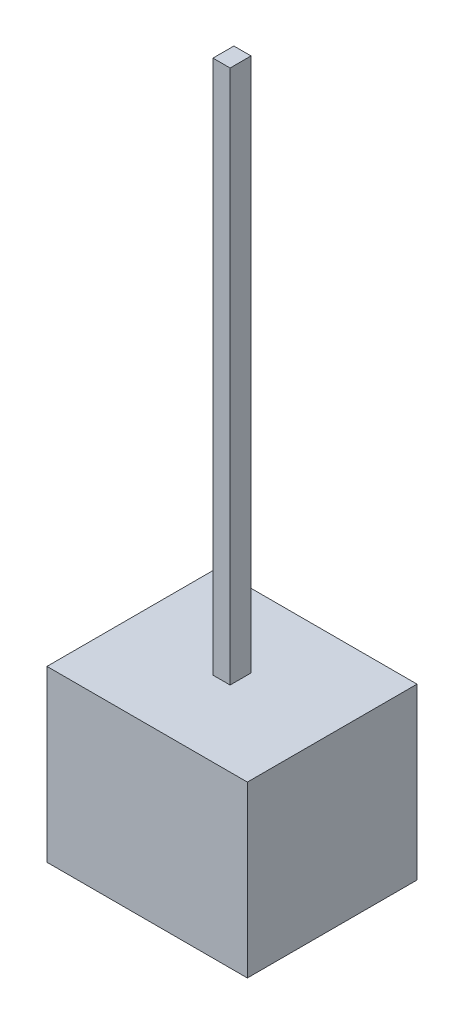
ISO-10303-21;
HEADER;
FILE_DESCRIPTION(('STEP AP214'),'2;1');
FILE_NAME('part.step','',(''),(''),'','','');
FILE_SCHEMA(('AUTOMOTIVE_DESIGN { 1 0 10303 214 1 1 1 1 }'));
ENDSEC;
DATA;
#1=APPLICATION_CONTEXT('core data for automotive mechanical design processes');
#2=APPLICATION_PROTOCOL_DEFINITION('international standard','automotive_design',2000,#1);
#3=PRODUCT_CONTEXT('',#1,'mechanical');
#4=PRODUCT('Part','Part','',(#3));
#5=PRODUCT_RELATED_PRODUCT_CATEGORY('part','',(#4));
#6=PRODUCT_DEFINITION_FORMATION('','',#4);
#7=PRODUCT_DEFINITION_CONTEXT('part definition',#1,'design');
#8=PRODUCT_DEFINITION('design','',#6,#7);
#9=PRODUCT_DEFINITION_SHAPE('','',#8);
#10=(LENGTH_UNIT() NAMED_UNIT(*) SI_UNIT(.MILLI.,.METRE.));
#11=(NAMED_UNIT(*) PLANE_ANGLE_UNIT() SI_UNIT($,.RADIAN.));
#12=(NAMED_UNIT(*) SI_UNIT($,.STERADIAN.) SOLID_ANGLE_UNIT());
#13=UNCERTAINTY_MEASURE_WITH_UNIT(LENGTH_MEASURE(1.E-05),#10,'distance_accuracy_value','');
#14=(GEOMETRIC_REPRESENTATION_CONTEXT(3) GLOBAL_UNCERTAINTY_ASSIGNED_CONTEXT((#13)) GLOBAL_UNIT_ASSIGNED_CONTEXT((#10,
#11,#12)) REPRESENTATION_CONTEXT('',''));
#15=CARTESIAN_POINT('',(0.,0.,0.));
#16=DIRECTION('',(0.,0.,1.));
#17=DIRECTION('',(1.,0.,0.));
#18=AXIS2_PLACEMENT_3D('',#15,#16,#17);
#19=CARTESIAN_POINT('',(3.,0.,0.));
#20=DIRECTION('',(0.,-1.,0.));
#21=DIRECTION('',(0.,0.,-1.));
#22=AXIS2_PLACEMENT_3D('',#19,#20,#21);
#23=PLANE('',#22);
#24=DIRECTION('',(0.,0.,1.));
#25=VECTOR('',#24,1.);
#26=CARTESIAN_POINT('',(0.,0.,0.));
#27=LINE('',#26,#25);
#28=CARTESIAN_POINT('',(0.,0.,-2.54));
#29=VERTEX_POINT('',#28);
#30=CARTESIAN_POINT('',(0.,0.,0.));
#31=VERTEX_POINT('',#30);
#32=EDGE_CURVE('E134',#29,#31,#27,.T.);
#33=ORIENTED_EDGE('',*,*,#32,.T.);
#34=DIRECTION('',(-1.,0.,0.));
#35=VECTOR('',#34,1.);
#36=CARTESIAN_POINT('',(3.,0.,0.));
#37=LINE('',#36,#35);
#38=CARTESIAN_POINT('',(3.,0.,0.));
#39=VERTEX_POINT('',#38);
#40=EDGE_CURVE('E139',#39,#31,#37,.T.);
#41=ORIENTED_EDGE('',*,*,#40,.F.);
#42=DIRECTION('',(0.,0.,1.));
#43=VECTOR('',#42,1.);
#44=CARTESIAN_POINT('',(3.,0.,0.));
#45=LINE('',#44,#43);
#46=CARTESIAN_POINT('',(3.,0.,-2.54));
#47=VERTEX_POINT('',#46);
#48=EDGE_CURVE('E138',#47,#39,#45,.T.);
#49=ORIENTED_EDGE('',*,*,#48,.F.);
#50=DIRECTION('',(-1.,0.,0.));
#51=VECTOR('',#50,1.);
#52=CARTESIAN_POINT('',(3.,0.,-2.54));
#53=LINE('',#52,#51);
#54=EDGE_CURVE('E147',#47,#29,#53,.T.);
#55=ORIENTED_EDGE('',*,*,#54,.T.);
#56=EDGE_LOOP('',(#33,#41,#49,#55));
#57=FACE_BOUND('',#56,.T.);
#58=DIRECTION('',(0.,0.,1.));
#59=VECTOR('',#58,1.);
#60=CARTESIAN_POINT('',(1.35618349313781,0.,-1.44206617785299));
#61=LINE('',#60,#59);
#62=CARTESIAN_POINT('',(1.35618349313781,0.,-1.44206617785299));
#63=VERTEX_POINT('',#62);
#64=CARTESIAN_POINT('',(1.35618349313781,0.,-1.12875164504607));
#65=VERTEX_POINT('',#64);
#66=EDGE_CURVE('E120',#63,#65,#61,.T.);
#67=ORIENTED_EDGE('',*,*,#66,.F.);
#68=DIRECTION('',(-1.,0.,0.));
#69=VECTOR('',#68,1.);
#70=CARTESIAN_POINT('',(1.35618349313781,0.,-1.44206617785299));
#71=LINE('',#70,#69);
#72=CARTESIAN_POINT('',(1.61299868396315,0.,-1.44206617785299));
#73=VERTEX_POINT('',#72);
#74=EDGE_CURVE('E117',#73,#63,#71,.T.);
#75=ORIENTED_EDGE('',*,*,#74,.F.);
#76=DIRECTION('',(0.,0.,-1.));
#77=VECTOR('',#76,1.);
#78=CARTESIAN_POINT('',(1.61299868396315,0.,-1.44206617785299));
#79=LINE('',#78,#77);
#80=CARTESIAN_POINT('',(1.61299868396315,0.,-1.12875164504607));
#81=VERTEX_POINT('',#80);
#82=EDGE_CURVE('E55',#81,#73,#79,.T.);
#83=ORIENTED_EDGE('',*,*,#82,.F.);
#84=DIRECTION('',(1.,0.,0.));
#85=VECTOR('',#84,1.);
#86=CARTESIAN_POINT('',(1.35618349313781,0.,-1.12875164504607));
#87=LINE('',#86,#85);
#88=EDGE_CURVE('E50',#65,#81,#87,.T.);
#89=ORIENTED_EDGE('',*,*,#88,.F.);
#90=EDGE_LOOP('',(#67,#75,#83,#89));
#91=FACE_BOUND('',#90,.T.);
#92=ADVANCED_FACE('F35',(#57,#91),#23,.F.);
#93=CARTESIAN_POINT('',(3.,0.,0.));
#94=DIRECTION('',(0.,0.,-1.));
#95=DIRECTION('',(0.,1.,0.));
#96=AXIS2_PLACEMENT_3D('',#93,#94,#95);
#97=PLANE('',#96);
#98=DIRECTION('',(0.,-1.,0.));
#99=VECTOR('',#98,1.);
#100=CARTESIAN_POINT('',(0.,0.,0.));
#101=LINE('',#100,#99);
#102=CARTESIAN_POINT('',(0.,-2.54,0.));
#103=VERTEX_POINT('',#102);
#104=EDGE_CURVE('E121',#31,#103,#101,.T.);
#105=ORIENTED_EDGE('',*,*,#104,.T.);
#106=DIRECTION('',(-1.,0.,0.));
#107=VECTOR('',#106,1.);
#108=CARTESIAN_POINT('',(3.,-2.54,0.));
#109=LINE('',#108,#107);
#110=CARTESIAN_POINT('',(3.,-2.54,0.));
#111=VERTEX_POINT('',#110);
#112=EDGE_CURVE('E11',#111,#103,#109,.T.);
#113=ORIENTED_EDGE('',*,*,#112,.F.);
#114=DIRECTION('',(0.,-1.,0.));
#115=VECTOR('',#114,1.);
#116=CARTESIAN_POINT('',(3.,0.,0.));
#117=LINE('',#116,#115);
#118=EDGE_CURVE('E130',#39,#111,#117,.T.);
#119=ORIENTED_EDGE('',*,*,#118,.F.);
#120=ORIENTED_EDGE('',*,*,#40,.T.);
#121=EDGE_LOOP('',(#105,#113,#119,#120));
#122=FACE_BOUND('',#121,.T.);
#123=ADVANCED_FACE('F37',(#122),#97,.F.);
#124=CARTESIAN_POINT('',(3.,-2.54,0.));
#125=DIRECTION('',(0.,1.,0.));
#126=DIRECTION('',(0.,0.,1.));
#127=AXIS2_PLACEMENT_3D('',#124,#125,#126);
#128=PLANE('',#127);
#129=DIRECTION('',(0.,0.,-1.));
#130=VECTOR('',#129,1.);
#131=CARTESIAN_POINT('',(0.,-2.54,0.));
#132=LINE('',#131,#130);
#133=CARTESIAN_POINT('',(0.,-2.54,-2.54));
#134=VERTEX_POINT('',#133);
#135=EDGE_CURVE('E124',#103,#134,#132,.T.);
#136=ORIENTED_EDGE('',*,*,#135,.T.);
#137=DIRECTION('',(-1.,0.,0.));
#138=VECTOR('',#137,1.);
#139=CARTESIAN_POINT('',(3.,-2.54,-2.54));
#140=LINE('',#139,#138);
#141=CARTESIAN_POINT('',(3.,-2.54,-2.54));
#142=VERTEX_POINT('',#141);
#143=EDGE_CURVE('E43',#142,#134,#140,.T.);
#144=ORIENTED_EDGE('',*,*,#143,.F.);
#145=DIRECTION('',(0.,0.,-1.));
#146=VECTOR('',#145,1.);
#147=CARTESIAN_POINT('',(3.,-2.54,0.));
#148=LINE('',#147,#146);
#149=EDGE_CURVE('E133',#111,#142,#148,.T.);
#150=ORIENTED_EDGE('',*,*,#149,.F.);
#151=ORIENTED_EDGE('',*,*,#112,.T.);
#152=EDGE_LOOP('',(#136,#144,#150,#151));
#153=FACE_BOUND('',#152,.T.);
#154=ADVANCED_FACE('F169',(#153),#128,.F.);
#155=CARTESIAN_POINT('',(3.,0.,-2.54));
#156=DIRECTION('',(0.,0.,1.));
#157=DIRECTION('',(1.,0.,0.));
#158=AXIS2_PLACEMENT_3D('',#155,#156,#157);
#159=PLANE('',#158);
#160=DIRECTION('',(0.,1.,0.));
#161=VECTOR('',#160,1.);
#162=CARTESIAN_POINT('',(0.,0.,-2.54));
#163=LINE('',#162,#161);
#164=EDGE_CURVE('E142',#134,#29,#163,.T.);
#165=ORIENTED_EDGE('',*,*,#164,.T.);
#166=ORIENTED_EDGE('',*,*,#54,.F.);
#167=DIRECTION('',(0.,1.,0.));
#168=VECTOR('',#167,1.);
#169=CARTESIAN_POINT('',(3.,0.,-2.54));
#170=LINE('',#169,#168);
#171=EDGE_CURVE('E136',#142,#47,#170,.T.);
#172=ORIENTED_EDGE('',*,*,#171,.F.);
#173=ORIENTED_EDGE('',*,*,#143,.T.);
#174=EDGE_LOOP('',(#165,#166,#172,#173));
#175=FACE_BOUND('',#174,.T.);
#176=ADVANCED_FACE('F154',(#175),#159,.F.);
#177=CARTESIAN_POINT('',(3.,0.,0.));
#178=DIRECTION('',(1.,0.,0.));
#179=DIRECTION('',(0.,0.,-1.));
#180=AXIS2_PLACEMENT_3D('',#177,#178,#179);
#181=PLANE('',#180);
#182=ORIENTED_EDGE('',*,*,#118,.T.);
#183=ORIENTED_EDGE('',*,*,#149,.T.);
#184=ORIENTED_EDGE('',*,*,#171,.T.);
#185=ORIENTED_EDGE('',*,*,#48,.T.);
#186=EDGE_LOOP('',(#182,#183,#184,#185));
#187=FACE_BOUND('',#186,.T.);
#188=ADVANCED_FACE('F168',(#187),#181,.T.);
#189=CARTESIAN_POINT('',(0.,0.,0.));
#190=DIRECTION('',(1.,0.,0.));
#191=DIRECTION('',(0.,0.,-1.));
#192=AXIS2_PLACEMENT_3D('',#189,#190,#191);
#193=PLANE('',#192);
#194=ORIENTED_EDGE('',*,*,#104,.F.);
#195=ORIENTED_EDGE('',*,*,#32,.F.);
#196=ORIENTED_EDGE('',*,*,#164,.F.);
#197=ORIENTED_EDGE('',*,*,#135,.F.);
#198=EDGE_LOOP('',(#194,#195,#196,#197));
#199=FACE_BOUND('',#198,.T.);
#200=ADVANCED_FACE('F160',(#199),#193,.F.);
#201=CARTESIAN_POINT('',(1.35618349313781,8.,-1.44206617785299));
#202=DIRECTION('',(1.,0.,0.));
#203=DIRECTION('',(0.,0.,-1.));
#204=AXIS2_PLACEMENT_3D('',#201,#202,#203);
#205=PLANE('',#204);
#206=ORIENTED_EDGE('',*,*,#66,.T.);
#207=DIRECTION('',(0.,-1.,0.));
#208=VECTOR('',#207,1.);
#209=CARTESIAN_POINT('',(1.35618349313781,8.,-1.12875164504607));
#210=LINE('',#209,#208);
#211=CARTESIAN_POINT('',(1.35618349313781,8.,-1.12875164504607));
#212=VERTEX_POINT('',#211);
#213=EDGE_CURVE('E101',#212,#65,#210,.T.);
#214=ORIENTED_EDGE('',*,*,#213,.F.);
#215=DIRECTION('',(0.,0.,1.));
#216=VECTOR('',#215,1.);
#217=CARTESIAN_POINT('',(1.35618349313781,8.,-1.44206617785299));
#218=LINE('',#217,#216);
#219=CARTESIAN_POINT('',(1.35618349313781,8.,-1.44206617785299));
#220=VERTEX_POINT('',#219);
#221=EDGE_CURVE('E108',#220,#212,#218,.T.);
#222=ORIENTED_EDGE('',*,*,#221,.F.);
#223=DIRECTION('',(0.,-1.,0.));
#224=VECTOR('',#223,1.);
#225=CARTESIAN_POINT('',(1.35618349313781,8.,-1.44206617785299));
#226=LINE('',#225,#224);
#227=EDGE_CURVE('E262',#220,#63,#226,.T.);
#228=ORIENTED_EDGE('',*,*,#227,.T.);
#229=EDGE_LOOP('',(#206,#214,#222,#228));
#230=FACE_BOUND('',#229,.T.);
#231=ADVANCED_FACE('F119',(#230),#205,.F.);
#232=CARTESIAN_POINT('',(1.35618349313781,8.,-1.12875164504607));
#233=DIRECTION('',(0.,0.,-1.));
#234=DIRECTION('',(-1.,0.,0.));
#235=AXIS2_PLACEMENT_3D('',#232,#233,#234);
#236=PLANE('',#235);
#237=ORIENTED_EDGE('',*,*,#88,.T.);
#238=DIRECTION('',(0.,-1.,0.));
#239=VECTOR('',#238,1.);
#240=CARTESIAN_POINT('',(1.61299868396315,8.,-1.12875164504607));
#241=LINE('',#240,#239);
#242=CARTESIAN_POINT('',(1.61299868396315,8.,-1.12875164504607));
#243=VERTEX_POINT('',#242);
#244=EDGE_CURVE('E104',#243,#81,#241,.T.);
#245=ORIENTED_EDGE('',*,*,#244,.F.);
#246=DIRECTION('',(1.,0.,0.));
#247=VECTOR('',#246,1.);
#248=CARTESIAN_POINT('',(1.35618349313781,8.,-1.12875164504607));
#249=LINE('',#248,#247);
#250=EDGE_CURVE('E97',#212,#243,#249,.T.);
#251=ORIENTED_EDGE('',*,*,#250,.F.);
#252=ORIENTED_EDGE('',*,*,#213,.T.);
#253=EDGE_LOOP('',(#237,#245,#251,#252));
#254=FACE_BOUND('',#253,.T.);
#255=ADVANCED_FACE('F99',(#254),#236,.F.);
#256=CARTESIAN_POINT('',(1.61299868396315,8.,-1.44206617785299));
#257=DIRECTION('',(-1.,0.,0.));
#258=DIRECTION('',(0.,0.,1.));
#259=AXIS2_PLACEMENT_3D('',#256,#257,#258);
#260=PLANE('',#259);
#261=ORIENTED_EDGE('',*,*,#82,.T.);
#262=DIRECTION('',(0.,-1.,0.));
#263=VECTOR('',#262,1.);
#264=CARTESIAN_POINT('',(1.61299868396315,8.,-1.44206617785299));
#265=LINE('',#264,#263);
#266=CARTESIAN_POINT('',(1.61299868396315,8.,-1.44206617785299));
#267=VERTEX_POINT('',#266);
#268=EDGE_CURVE('E126',#267,#73,#265,.T.);
#269=ORIENTED_EDGE('',*,*,#268,.F.);
#270=DIRECTION('',(0.,0.,-1.));
#271=VECTOR('',#270,1.);
#272=CARTESIAN_POINT('',(1.61299868396315,8.,-1.44206617785299));
#273=LINE('',#272,#271);
#274=EDGE_CURVE('E107',#243,#267,#273,.T.);
#275=ORIENTED_EDGE('',*,*,#274,.F.);
#276=ORIENTED_EDGE('',*,*,#244,.T.);
#277=EDGE_LOOP('',(#261,#269,#275,#276));
#278=FACE_BOUND('',#277,.T.);
#279=ADVANCED_FACE('F189',(#278),#260,.F.);
#280=CARTESIAN_POINT('',(1.35618349313781,8.,-1.44206617785299));
#281=DIRECTION('',(0.,0.,1.));
#282=DIRECTION('',(1.,0.,0.));
#283=AXIS2_PLACEMENT_3D('',#280,#281,#282);
#284=PLANE('',#283);
#285=ORIENTED_EDGE('',*,*,#74,.T.);
#286=ORIENTED_EDGE('',*,*,#227,.F.);
#287=DIRECTION('',(-1.,0.,0.));
#288=VECTOR('',#287,1.);
#289=CARTESIAN_POINT('',(1.35618349313781,8.,-1.44206617785299));
#290=LINE('',#289,#288);
#291=EDGE_CURVE('E113',#267,#220,#290,.T.);
#292=ORIENTED_EDGE('',*,*,#291,.F.);
#293=ORIENTED_EDGE('',*,*,#268,.T.);
#294=EDGE_LOOP('',(#285,#286,#292,#293));
#295=FACE_BOUND('',#294,.T.);
#296=ADVANCED_FACE('F192',(#295),#284,.F.);
#297=CARTESIAN_POINT('',(0.,8.,0.));
#298=DIRECTION('',(0.,1.,0.));
#299=DIRECTION('',(0.,0.,1.));
#300=AXIS2_PLACEMENT_3D('',#297,#298,#299);
#301=PLANE('',#300);
#302=ORIENTED_EDGE('',*,*,#221,.T.);
#303=ORIENTED_EDGE('',*,*,#250,.T.);
#304=ORIENTED_EDGE('',*,*,#274,.T.);
#305=ORIENTED_EDGE('',*,*,#291,.T.);
#306=EDGE_LOOP('',(#302,#303,#304,#305));
#307=FACE_BOUND('',#306,.T.);
#308=ADVANCED_FACE('F111',(#307),#301,.T.);
#309=CLOSED_SHELL('',(#92,#123,#154,#176,#188,#200,#231,#255,#279,#296,#308));
#310=MANIFOLD_SOLID_BREP('B2',#309);
#311=ADVANCED_BREP_SHAPE_REPRESENTATION('',(#18,#310),#14);
#312=SHAPE_DEFINITION_REPRESENTATION(#9,#311);
ENDSEC;
END-ISO-10303-21;
